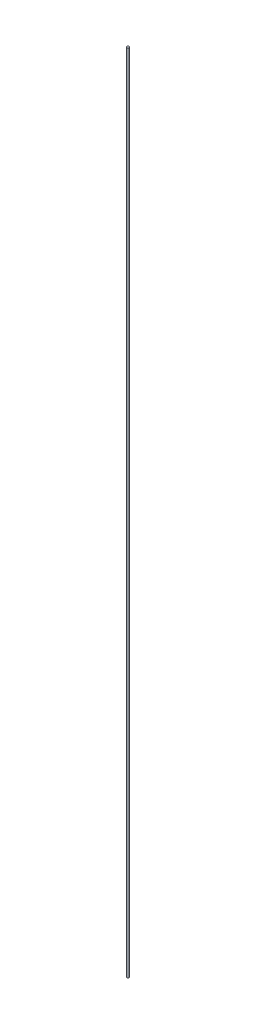
ISO-10303-21;
HEADER;
FILE_DESCRIPTION(('STEP AP214'),'2;1');
FILE_NAME('part.step','',(''),(''),'','','');
FILE_SCHEMA(('AUTOMOTIVE_DESIGN { 1 0 10303 214 1 1 1 1 }'));
ENDSEC;
DATA;
#1=APPLICATION_CONTEXT('core data for automotive mechanical design processes');
#2=APPLICATION_PROTOCOL_DEFINITION('international standard','automotive_design',2000,#1);
#3=PRODUCT_CONTEXT('',#1,'mechanical');
#4=PRODUCT('Part','Part','',(#3));
#5=PRODUCT_RELATED_PRODUCT_CATEGORY('part','',(#4));
#6=PRODUCT_DEFINITION_FORMATION('','',#4);
#7=PRODUCT_DEFINITION_CONTEXT('part definition',#1,'design');
#8=PRODUCT_DEFINITION('design','',#6,#7);
#9=PRODUCT_DEFINITION_SHAPE('','',#8);
#10=(LENGTH_UNIT() NAMED_UNIT(*) SI_UNIT(.MILLI.,.METRE.));
#11=(NAMED_UNIT(*) PLANE_ANGLE_UNIT() SI_UNIT($,.RADIAN.));
#12=(NAMED_UNIT(*) SI_UNIT($,.STERADIAN.) SOLID_ANGLE_UNIT());
#13=UNCERTAINTY_MEASURE_WITH_UNIT(LENGTH_MEASURE(1.E-05),#10,'distance_accuracy_value','');
#14=(GEOMETRIC_REPRESENTATION_CONTEXT(3) GLOBAL_UNCERTAINTY_ASSIGNED_CONTEXT((#13)) GLOBAL_UNIT_ASSIGNED_CONTEXT((#10,
#11,#12)) REPRESENTATION_CONTEXT('',''));
#15=CARTESIAN_POINT('',(0.,0.,0.));
#16=DIRECTION('',(0.,0.,1.));
#17=DIRECTION('',(1.,0.,0.));
#18=AXIS2_PLACEMENT_3D('',#15,#16,#17);
#19=CARTESIAN_POINT('',(0.,1000.,0.));
#20=DIRECTION('',(0.,-1.,0.));
#21=DIRECTION('',(0.,0.,-1.));
#22=AXIS2_PLACEMENT_3D('',#19,#20,#21);
#23=PLANE('',#22);
#24=CARTESIAN_POINT('',(0.,1000.,0.));
#25=DIRECTION('',(0.,-1.,0.));
#26=DIRECTION('',(0.,0.,-1.));
#27=AXIS2_PLACEMENT_3D('',#24,#25,#26);
#28=CIRCLE('',#27,1.5);
#29=CARTESIAN_POINT('',(0.,1000.,-1.5));
#30=VERTEX_POINT('',#29);
#31=EDGE_CURVE('E17',#30,#30,#28,.T.);
#32=ORIENTED_EDGE('',*,*,#31,.F.);
#33=EDGE_LOOP('',(#32));
#34=FACE_BOUND('',#33,.T.);
#35=ADVANCED_FACE('F14',(#34),#23,.F.);
#36=CARTESIAN_POINT('',(0.,0.,0.));
#37=DIRECTION('',(0.,-1.,0.));
#38=DIRECTION('',(0.,0.,-1.));
#39=AXIS2_PLACEMENT_3D('',#36,#37,#38);
#40=PLANE('',#39);
#41=CARTESIAN_POINT('',(0.,0.,0.));
#42=DIRECTION('',(0.,-1.,0.));
#43=DIRECTION('',(0.,0.,-1.));
#44=AXIS2_PLACEMENT_3D('',#41,#42,#43);
#45=CIRCLE('',#44,1.5);
#46=CARTESIAN_POINT('',(0.,0.,-1.5));
#47=VERTEX_POINT('',#46);
#48=EDGE_CURVE('E9',#47,#47,#45,.F.);
#49=ORIENTED_EDGE('',*,*,#48,.F.);
#50=EDGE_LOOP('',(#49));
#51=FACE_BOUND('',#50,.T.);
#52=ADVANCED_FACE('F29',(#51),#40,.T.);
#53=CARTESIAN_POINT('',(0.,1000.,0.));
#54=DIRECTION('',(0.,-1.,0.));
#55=DIRECTION('',(0.,0.,-1.));
#56=AXIS2_PLACEMENT_3D('',#53,#54,#55);
#57=CYLINDRICAL_SURFACE('',#56,1.5);
#58=ORIENTED_EDGE('',*,*,#48,.T.);
#59=EDGE_LOOP('',(#58));
#60=FACE_BOUND('',#59,.T.);
#61=ORIENTED_EDGE('',*,*,#31,.T.);
#62=EDGE_LOOP('',(#61));
#63=FACE_BOUND('',#62,.T.);
#64=ADVANCED_FACE('F26',(#60,#63),#57,.T.);
#65=CLOSED_SHELL('',(#35,#52,#64));
#66=MANIFOLD_SOLID_BREP('B1',#65);
#67=ADVANCED_BREP_SHAPE_REPRESENTATION('',(#18,#66),#14);
#68=SHAPE_DEFINITION_REPRESENTATION(#9,#67);
ENDSEC;
END-ISO-10303-21;
